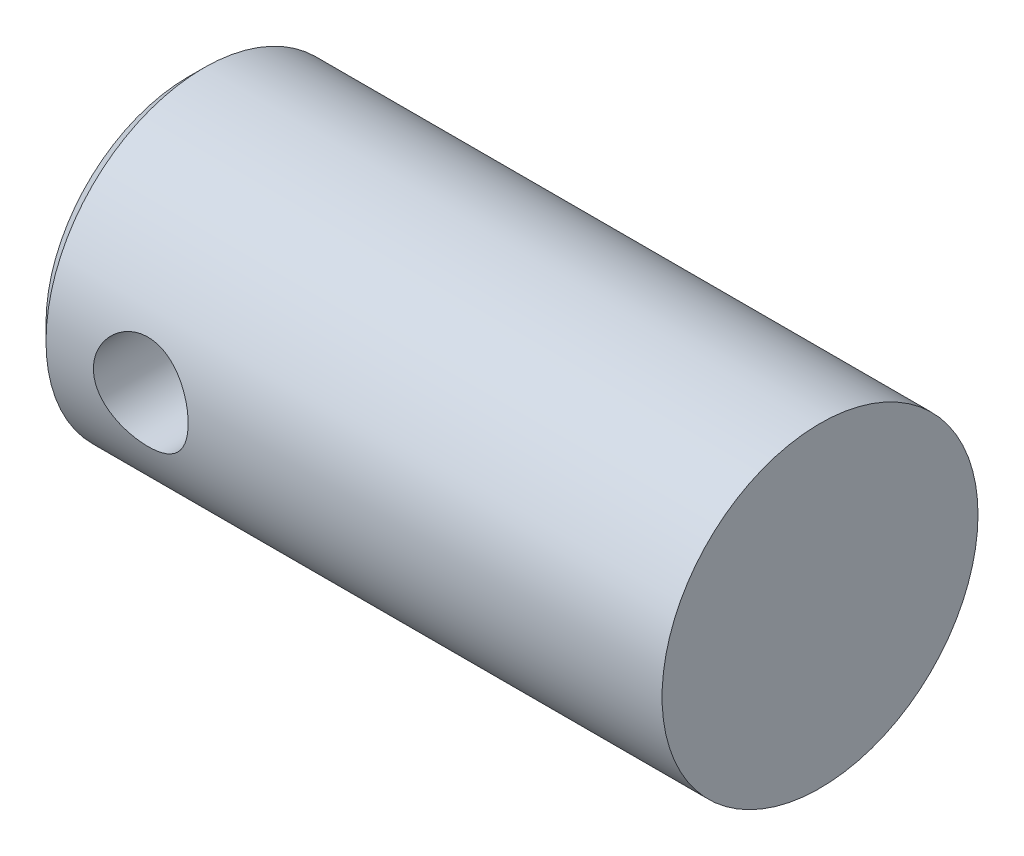
ISO-10303-21;
HEADER;
FILE_DESCRIPTION(('STEP AP214'),'2;1');
FILE_NAME('part.step','',(''),(''),'','','');
FILE_SCHEMA(('AUTOMOTIVE_DESIGN { 1 0 10303 214 1 1 1 1 }'));
ENDSEC;
DATA;
#1=APPLICATION_CONTEXT('core data for automotive mechanical design processes');
#2=APPLICATION_PROTOCOL_DEFINITION('international standard','automotive_design',2000,#1);
#3=PRODUCT_CONTEXT('',#1,'mechanical');
#4=PRODUCT('Part','Part','',(#3));
#5=PRODUCT_RELATED_PRODUCT_CATEGORY('part','',(#4));
#6=PRODUCT_DEFINITION_FORMATION('','',#4);
#7=PRODUCT_DEFINITION_CONTEXT('part definition',#1,'design');
#8=PRODUCT_DEFINITION('design','',#6,#7);
#9=PRODUCT_DEFINITION_SHAPE('','',#8);
#10=(LENGTH_UNIT() NAMED_UNIT(*) SI_UNIT(.MILLI.,.METRE.));
#11=(NAMED_UNIT(*) PLANE_ANGLE_UNIT() SI_UNIT($,.RADIAN.));
#12=(NAMED_UNIT(*) SI_UNIT($,.STERADIAN.) SOLID_ANGLE_UNIT());
#13=UNCERTAINTY_MEASURE_WITH_UNIT(LENGTH_MEASURE(1.E-05),#10,'distance_accuracy_value','');
#14=(GEOMETRIC_REPRESENTATION_CONTEXT(3) GLOBAL_UNCERTAINTY_ASSIGNED_CONTEXT((#13)) GLOBAL_UNIT_ASSIGNED_CONTEXT((#10,
#11,#12)) REPRESENTATION_CONTEXT('',''));
#15=CARTESIAN_POINT('',(0.,0.,0.));
#16=DIRECTION('',(0.,0.,1.));
#17=DIRECTION('',(1.,0.,0.));
#18=AXIS2_PLACEMENT_3D('',#15,#16,#17);
#19=CARTESIAN_POINT('',(0.,5.,0.));
#20=DIRECTION('',(1.,0.,0.));
#21=DIRECTION('',(0.,0.,-1.));
#22=AXIS2_PLACEMENT_3D('',#19,#20,#21);
#23=PLANE('',#22);
#24=CARTESIAN_POINT('',(0.,0.,0.));
#25=DIRECTION('',(1.,0.,0.));
#26=DIRECTION('',(0.,0.,-1.));
#27=AXIS2_PLACEMENT_3D('',#24,#25,#26);
#28=CIRCLE('',#27,5.);
#29=CARTESIAN_POINT('',(0.,0.,-5.));
#30=VERTEX_POINT('',#29);
#31=EDGE_CURVE('E78',#30,#30,#28,.T.);
#32=ORIENTED_EDGE('',*,*,#31,.T.);
#33=EDGE_LOOP('',(#32));
#34=FACE_BOUND('',#33,.T.);
#35=ADVANCED_FACE('F32',(#34),#23,.T.);
#36=CARTESIAN_POINT('',(0.,0.,0.));
#37=DIRECTION('',(1.,0.,0.));
#38=DIRECTION('',(0.,0.,-1.));
#39=AXIS2_PLACEMENT_3D('',#36,#37,#38);
#40=CYLINDRICAL_SURFACE('',#39,5.);
#41=CARTESIAN_POINT('',(-15.,0.,-5.));
#42=CARTESIAN_POINT('',(-15.0000009974849,-0.0822886127533,-4.99999929250549));
#43=CARTESIAN_POINT('',(-15.006793863624,-0.16458731835153,-4.99794915693953));
#44=CARTESIAN_POINT('',(-15.0337213542221,-0.326788125304881,-4.98997105593691));
#45=CARTESIAN_POINT('',(-15.0538599580233,-0.40668950441142,-4.98404193389692));
#46=CARTESIAN_POINT('',(-15.1067460169103,-0.561732707754527,-4.96895552501836));
#47=CARTESIAN_POINT('',(-15.1394748696189,-0.636881364395374,-4.95980300250425));
#48=CARTESIAN_POINT('',(-15.2165360930558,-0.780624181053132,-4.93922109237645));
#49=CARTESIAN_POINT('',(-15.2608700073954,-0.84921746746967,-4.92779140192066));
#50=CARTESIAN_POINT('',(-15.3612240074727,-0.979871797183746,-4.90350737192774));
#51=CARTESIAN_POINT('',(-15.4175166258859,-1.04171807124434,-4.89062383657036));
#52=CARTESIAN_POINT('',(-15.5396092299102,-1.15524920923324,-4.86505834210442));
#53=CARTESIAN_POINT('',(-15.605410812125,-1.20693236327441,-4.85237641724501));
#54=CARTESIAN_POINT('',(-15.7464707530376,-1.29980037723708,-4.82834113993772));
#55=CARTESIAN_POINT('',(-15.8219084609907,-1.34072309022214,-4.81702406663874));
#56=CARTESIAN_POINT('',(-15.9789892542303,-1.4092139477476,-4.79743620394031));
#57=CARTESIAN_POINT('',(-16.060630843928,-1.43678529919973,-4.7891646831331));
#58=CARTESIAN_POINT('',(-16.2253902661305,-1.47701633682652,-4.77690870838434));
#59=CARTESIAN_POINT('',(-16.3084027438639,-1.49007196234677,-4.77281069324533));
#60=CARTESIAN_POINT('',(-16.4755331562168,-1.50213730614672,-4.76902789749767));
#61=CARTESIAN_POINT('',(-16.5596508180591,-1.50115042761078,-4.76934204760571));
#62=CARTESIAN_POINT('',(-16.7233839086085,-1.48546977199812,-4.77424744067777));
#63=CARTESIAN_POINT('',(-16.8030522503622,-1.47127205262685,-4.7786838859914));
#64=CARTESIAN_POINT('',(-16.9588197862735,-1.43037420427056,-4.79108356228624));
#65=CARTESIAN_POINT('',(-17.0349186273743,-1.40367284141641,-4.7990471413235));
#66=CARTESIAN_POINT('',(-17.1826003496607,-1.33816026653682,-4.81772733074973));
#67=CARTESIAN_POINT('',(-17.2541070839553,-1.29918816934642,-4.82848016115952));
#68=CARTESIAN_POINT('',(-17.3897320220102,-1.21035222588683,-4.85150987000064));
#69=CARTESIAN_POINT('',(-17.4538484294138,-1.16048574002588,-4.86378711746991));
#70=CARTESIAN_POINT('',(-17.575686190762,-1.04881290765546,-4.88911011297937));
#71=CARTESIAN_POINT('',(-17.6330286640297,-0.986594907466973,-4.90216654310498));
#72=CARTESIAN_POINT('',(-17.7365539840643,-0.853263259313968,-4.92712244063258));
#73=CARTESIAN_POINT('',(-17.7827361284144,-0.78214905186089,-4.9390218351841));
#74=CARTESIAN_POINT('',(-17.8628599224647,-0.632355038342805,-4.9604316006947));
#75=CARTESIAN_POINT('',(-17.8967175162499,-0.553627749747951,-4.96992543668314));
#76=CARTESIAN_POINT('',(-17.9505995900996,-0.391245415603519,-4.98533521832222));
#77=CARTESIAN_POINT('',(-17.9706279285325,-0.307591751589581,-4.99125216186999));
#78=CARTESIAN_POINT('',(-17.9956521778994,-0.140952242668331,-4.99868364643538));
#79=CARTESIAN_POINT('',(-18.0011615858016,-0.0580500976011869,-5.0003485041779));
#80=CARTESIAN_POINT('',(-17.9984308442879,0.107499605823383,-4.99952923241759));
#81=CARTESIAN_POINT('',(-17.9901925303486,0.190147196690781,-4.99704565677756));
#82=CARTESIAN_POINT('',(-17.9606153888885,0.350903605309697,-4.98830696987163));
#83=CARTESIAN_POINT('',(-17.9395766124191,0.429072772614169,-4.98213829799416));
#84=CARTESIAN_POINT('',(-17.8853567672218,0.580754638954522,-4.96674347841532));
#85=CARTESIAN_POINT('',(-17.8521742389621,0.654266777025584,-4.95751696321085));
#86=CARTESIAN_POINT('',(-17.7737468345189,0.796437189461053,-4.93669654351324));
#87=CARTESIAN_POINT('',(-17.728240659052,0.864943826199669,-4.92505280829675));
#88=CARTESIAN_POINT('',(-17.6267752459472,0.993523307980147,-4.90073468764317));
#89=CARTESIAN_POINT('',(-17.5708133881123,1.05359403235594,-4.8880600443108));
#90=CARTESIAN_POINT('',(-17.4476126916307,1.16585744551027,-4.86253171869138));
#91=CARTESIAN_POINT('',(-17.3800381242283,1.21768481231504,-4.84968825033267));
#92=CARTESIAN_POINT('',(-17.2368720609865,1.30928995072154,-4.82576515238463));
#93=CARTESIAN_POINT('',(-17.1612807754418,1.34906803829472,-4.81468547654651));
#94=CARTESIAN_POINT('',(-17.0044675087453,1.41517347127168,-4.79567189615055));
#95=CARTESIAN_POINT('',(-16.9232738134634,1.4415634693705,-4.78772337843827));
#96=CARTESIAN_POINT('',(-16.7573120310685,1.48021730815114,-4.77591594362794));
#97=CARTESIAN_POINT('',(-16.6725451792123,1.49248598978779,-4.772055625083));
#98=CARTESIAN_POINT('',(-16.5056384816238,1.50221984485059,-4.76899972496087));
#99=CARTESIAN_POINT('',(-16.4235363489824,1.5002805530849,-4.76961647442754));
#100=CARTESIAN_POINT('',(-16.2608858966272,1.48307505444813,-4.77499401288294));
#101=CARTESIAN_POINT('',(-16.1803375148236,1.46780938124716,-4.77975463592551));
#102=CARTESIAN_POINT('',(-16.0240546008571,1.42476888804136,-4.79275763670385));
#103=CARTESIAN_POINT('',(-15.9482727126383,1.39715175507068,-4.80095604545964));
#104=CARTESIAN_POINT('',(-15.8023575611823,1.33031507121129,-4.81990278909136));
#105=CARTESIAN_POINT('',(-15.7322253823592,1.29109329962876,-4.83065161194312));
#106=CARTESIAN_POINT('',(-15.5968368834729,1.20048763805072,-4.85397676425833));
#107=CARTESIAN_POINT('',(-15.5318512387396,1.14871276092994,-4.86660540163797));
#108=CARTESIAN_POINT('',(-15.4112975016921,1.03517434629782,-4.89201320450026));
#109=CARTESIAN_POINT('',(-15.3557318605322,0.9734082171345,-4.90479240823905));
#110=CARTESIAN_POINT('',(-15.253976587705,0.839465762183248,-4.92950936570649));
#111=CARTESIAN_POINT('',(-15.2081085531445,0.767037885790607,-4.94141159765674));
#112=CARTESIAN_POINT('',(-15.129264830096,0.615141373983529,-4.96260680455813));
#113=CARTESIAN_POINT('',(-15.0962831117255,0.535676052998954,-4.97190099931066));
#114=CARTESIAN_POINT('',(-15.0471047243473,0.380757712655281,-4.98602174969301));
#115=CARTESIAN_POINT('',(-15.0294883271168,0.305786961954234,-4.99122027381067));
#116=CARTESIAN_POINT('',(-15.0059364747584,0.153880195230779,-4.99820944494492));
#117=CARTESIAN_POINT('',(-14.9999990672952,0.0769445098581395,-5.0000006615474));
#118=CARTESIAN_POINT('',(-15.,0.,-5.));
#119=B_SPLINE_CURVE_WITH_KNOTS('',3,(#41,#42,#43,#44,#45,#46,#47,#48,#49,#50,#51,#52,#53,#54,
#55,#56,#57,#58,#59,#60,#61,#62,#63,#64,#65,#66,#67,#68,#69,#70,#71,#72,#73,#74,#75,#76,#77,#78,
#79,#80,#81,#82,#83,#84,#85,#86,#87,#88,#89,#90,#91,#92,#93,#94,#95,#96,#97,#98,#99,#100,#101,
#102,#103,#104,#105,#106,#107,#108,#109,#110,#111,#112,#113,#114,#115,#116,#117,#118),
.UNSPECIFIED.,.T.,.F.,(4,2,2,2,2,2,2,2,2,2,2,2,2,2,2,2,2,2,2,2,2,2,2,2,2,2,2,2,2,2,2,2,2,2,2,2,
2,2,4),(0.,0.246583203612611,0.493239964846,0.739533676300876,0.985860164412704,
1.23855602948192,1.49129437288633,1.74971481004109,2.00807314543224,2.25919689356599,
2.5102597831909,2.75226016697676,2.99428443658001,3.2396242644712,3.48502360158555,
3.74067104048167,3.99633456531072,4.25371046881689,4.51101453528808,4.75908809438545,
5.00712853550327,5.24956746682327,5.49203554593729,5.74011305702908,5.98825282000191,
6.24540400322819,6.50254844252681,6.75847814951252,7.01432009460283,7.25950155466943,
7.504673196616,7.74680040402722,7.98897397553108,8.23996925679931,8.49102974897503,
8.74942996156671,9.00770911595235,9.2383169193046,9.46888616948875),.UNSPECIFIED.);
#120=CARTESIAN_POINT('',(-15.,0.,-5.));
#121=VERTEX_POINT('',#120);
#122=EDGE_CURVE('E10',#121,#121,#119,.T.);
#123=ORIENTED_EDGE('',*,*,#122,.F.);
#124=EDGE_LOOP('',(#123));
#125=FACE_BOUND('',#124,.T.);
#126=CARTESIAN_POINT('',(-15.,0.,5.));
#127=CARTESIAN_POINT('',(-15.0000009974849,0.0822886127533,4.99999929250549));
#128=CARTESIAN_POINT('',(-15.006793863624,0.16458731835153,4.99794915693953));
#129=CARTESIAN_POINT('',(-15.0337213542221,0.326788125304881,4.98997105593691));
#130=CARTESIAN_POINT('',(-15.0538599580233,0.40668950441142,4.98404193389692));
#131=CARTESIAN_POINT('',(-15.1067460169103,0.561732707754527,4.96895552501836));
#132=CARTESIAN_POINT('',(-15.1394748696189,0.636881364395374,4.95980300250425));
#133=CARTESIAN_POINT('',(-15.2165360930558,0.780624181053132,4.93922109237645));
#134=CARTESIAN_POINT('',(-15.2608700073954,0.84921746746967,4.92779140192066));
#135=CARTESIAN_POINT('',(-15.3612240074727,0.979871797183746,4.90350737192774));
#136=CARTESIAN_POINT('',(-15.4175166258859,1.04171807124434,4.89062383657036));
#137=CARTESIAN_POINT('',(-15.5396092299102,1.15524920923324,4.86505834210442));
#138=CARTESIAN_POINT('',(-15.605410812125,1.20693236327441,4.85237641724501));
#139=CARTESIAN_POINT('',(-15.7464707530376,1.29980037723708,4.82834113993772));
#140=CARTESIAN_POINT('',(-15.8219084609907,1.34072309022214,4.81702406663874));
#141=CARTESIAN_POINT('',(-15.9789892542303,1.4092139477476,4.79743620394031));
#142=CARTESIAN_POINT('',(-16.060630843928,1.43678529919973,4.7891646831331));
#143=CARTESIAN_POINT('',(-16.2253902661305,1.47701633682652,4.77690870838434));
#144=CARTESIAN_POINT('',(-16.3084027438639,1.49007196234677,4.77281069324533));
#145=CARTESIAN_POINT('',(-16.4755331562168,1.50213730614672,4.76902789749767));
#146=CARTESIAN_POINT('',(-16.5596508180591,1.50115042761078,4.76934204760571));
#147=CARTESIAN_POINT('',(-16.7233839086085,1.48546977199812,4.77424744067777));
#148=CARTESIAN_POINT('',(-16.8030522503622,1.47127205262685,4.7786838859914));
#149=CARTESIAN_POINT('',(-16.9588197862735,1.43037420427056,4.79108356228624));
#150=CARTESIAN_POINT('',(-17.0349186273743,1.40367284141641,4.7990471413235));
#151=CARTESIAN_POINT('',(-17.1826003496607,1.33816026653682,4.81772733074973));
#152=CARTESIAN_POINT('',(-17.2541070839553,1.29918816934642,4.82848016115952));
#153=CARTESIAN_POINT('',(-17.3897320220102,1.21035222588683,4.85150987000064));
#154=CARTESIAN_POINT('',(-17.4538484294138,1.16048574002588,4.86378711746991));
#155=CARTESIAN_POINT('',(-17.575686190762,1.04881290765546,4.88911011297937));
#156=CARTESIAN_POINT('',(-17.6330286640297,0.986594907466973,4.90216654310498));
#157=CARTESIAN_POINT('',(-17.7365539840643,0.853263259313968,4.92712244063258));
#158=CARTESIAN_POINT('',(-17.7827361284144,0.78214905186089,4.9390218351841));
#159=CARTESIAN_POINT('',(-17.8628599224647,0.632355038342805,4.9604316006947));
#160=CARTESIAN_POINT('',(-17.8967175162499,0.553627749747951,4.96992543668314));
#161=CARTESIAN_POINT('',(-17.9505995900996,0.391245415603519,4.98533521832222));
#162=CARTESIAN_POINT('',(-17.9706279285325,0.307591751589581,4.99125216186999));
#163=CARTESIAN_POINT('',(-17.9956521778994,0.140952242668331,4.99868364643538));
#164=CARTESIAN_POINT('',(-18.0011615858016,0.0580500976011869,5.0003485041779));
#165=CARTESIAN_POINT('',(-17.9984308442879,-0.107499605823383,4.99952923241759));
#166=CARTESIAN_POINT('',(-17.9901925303486,-0.190147196690781,4.99704565677756));
#167=CARTESIAN_POINT('',(-17.9606153888885,-0.350903605309697,4.98830696987163));
#168=CARTESIAN_POINT('',(-17.9395766124191,-0.429072772614169,4.98213829799416));
#169=CARTESIAN_POINT('',(-17.8853567672218,-0.580754638954522,4.96674347841532));
#170=CARTESIAN_POINT('',(-17.8521742389621,-0.654266777025584,4.95751696321085));
#171=CARTESIAN_POINT('',(-17.7737468345189,-0.796437189461053,4.93669654351324));
#172=CARTESIAN_POINT('',(-17.728240659052,-0.864943826199669,4.92505280829675));
#173=CARTESIAN_POINT('',(-17.6267752459472,-0.993523307980147,4.90073468764317));
#174=CARTESIAN_POINT('',(-17.5708133881123,-1.05359403235594,4.8880600443108));
#175=CARTESIAN_POINT('',(-17.4476126916307,-1.16585744551027,4.86253171869138));
#176=CARTESIAN_POINT('',(-17.3800381242283,-1.21768481231504,4.84968825033267));
#177=CARTESIAN_POINT('',(-17.2368720609865,-1.30928995072154,4.82576515238463));
#178=CARTESIAN_POINT('',(-17.1612807754418,-1.34906803829472,4.81468547654651));
#179=CARTESIAN_POINT('',(-17.0044675087453,-1.41517347127168,4.79567189615055));
#180=CARTESIAN_POINT('',(-16.9232738134634,-1.4415634693705,4.78772337843827));
#181=CARTESIAN_POINT('',(-16.7573120310685,-1.48021730815114,4.77591594362794));
#182=CARTESIAN_POINT('',(-16.6725451792123,-1.49248598978779,4.772055625083));
#183=CARTESIAN_POINT('',(-16.5056384816238,-1.50221984485059,4.76899972496087));
#184=CARTESIAN_POINT('',(-16.4235363489824,-1.5002805530849,4.76961647442754));
#185=CARTESIAN_POINT('',(-16.2608858966272,-1.48307505444813,4.77499401288294));
#186=CARTESIAN_POINT('',(-16.1803375148236,-1.46780938124716,4.77975463592551));
#187=CARTESIAN_POINT('',(-16.0240546008571,-1.42476888804136,4.79275763670385));
#188=CARTESIAN_POINT('',(-15.9482727126383,-1.39715175507068,4.80095604545964));
#189=CARTESIAN_POINT('',(-15.8023575611823,-1.33031507121129,4.81990278909136));
#190=CARTESIAN_POINT('',(-15.7322253823592,-1.29109329962876,4.83065161194312));
#191=CARTESIAN_POINT('',(-15.5968368834729,-1.20048763805072,4.85397676425833));
#192=CARTESIAN_POINT('',(-15.5318512387396,-1.14871276092994,4.86660540163797));
#193=CARTESIAN_POINT('',(-15.4112975016921,-1.03517434629782,4.89201320450026));
#194=CARTESIAN_POINT('',(-15.3557318605322,-0.9734082171345,4.90479240823905));
#195=CARTESIAN_POINT('',(-15.253976587705,-0.839465762183248,4.92950936570649));
#196=CARTESIAN_POINT('',(-15.2081085531445,-0.767037885790607,4.94141159765674));
#197=CARTESIAN_POINT('',(-15.129264830096,-0.615141373983529,4.96260680455813));
#198=CARTESIAN_POINT('',(-15.0962831117255,-0.535676052998954,4.97190099931066));
#199=CARTESIAN_POINT('',(-15.0471047243473,-0.380757712655281,4.98602174969301));
#200=CARTESIAN_POINT('',(-15.0294883271168,-0.305786961954234,4.99122027381067));
#201=CARTESIAN_POINT('',(-15.0059364747584,-0.153880195230779,4.99820944494492));
#202=CARTESIAN_POINT('',(-14.9999990672952,-0.0769445098581395,5.0000006615474));
#203=CARTESIAN_POINT('',(-15.,0.,5.));
#204=B_SPLINE_CURVE_WITH_KNOTS('',3,(#126,#127,#128,#129,#130,#131,#132,#133,#134,#135,#136,
#137,#138,#139,#140,#141,#142,#143,#144,#145,#146,#147,#148,#149,#150,#151,#152,#153,#154,#155,
#156,#157,#158,#159,#160,#161,#162,#163,#164,#165,#166,#167,#168,#169,#170,#171,#172,#173,#174,
#175,#176,#177,#178,#179,#180,#181,#182,#183,#184,#185,#186,#187,#188,#189,#190,#191,#192,#193,
#194,#195,#196,#197,#198,#199,#200,#201,#202,#203),.UNSPECIFIED.,.T.,.F.,(4,2,2,2,2,2,2,2,2,2,2,
2,2,2,2,2,2,2,2,2,2,2,2,2,2,2,2,2,2,2,2,2,2,2,2,2,2,2,4),(0.,0.246583203612611,0.493239964846,
0.739533676300876,0.985860164412704,1.23855602948192,1.49129437288633,1.74971481004109,
2.00807314543224,2.25919689356599,2.5102597831909,2.75226016697676,2.99428443658001,
3.2396242644712,3.48502360158555,3.74067104048167,3.99633456531072,4.25371046881689,
4.51101453528808,4.75908809438545,5.00712853550327,5.24956746682327,5.49203554593729,
5.74011305702908,5.98825282000191,6.24540400322819,6.50254844252681,6.75847814951252,
7.01432009460283,7.25950155466943,7.504673196616,7.74680040402722,7.98897397553108,
8.23996925679931,8.49102974897503,8.74942996156671,9.00770911595235,9.2383169193046,
9.46888616948875),.UNSPECIFIED.);
#205=CARTESIAN_POINT('',(-15.,0.,5.));
#206=VERTEX_POINT('',#205);
#207=EDGE_CURVE('E43',#206,#206,#204,.T.);
#208=ORIENTED_EDGE('',*,*,#207,.F.);
#209=EDGE_LOOP('',(#208));
#210=FACE_BOUND('',#209,.T.);
#211=CARTESIAN_POINT('',(-19.5,0.,0.));
#212=DIRECTION('',(-1.,0.,0.));
#213=DIRECTION('',(0.,0.,1.));
#214=AXIS2_PLACEMENT_3D('',#211,#212,#213);
#215=CIRCLE('',#214,5.);
#216=CARTESIAN_POINT('',(-19.5,0.,5.));
#217=VERTEX_POINT('',#216);
#218=EDGE_CURVE('E51',#217,#217,#215,.F.);
#219=ORIENTED_EDGE('',*,*,#218,.T.);
#220=EDGE_LOOP('',(#219));
#221=FACE_BOUND('',#220,.T.);
#222=ORIENTED_EDGE('',*,*,#31,.F.);
#223=EDGE_LOOP('',(#222));
#224=FACE_BOUND('',#223,.T.);
#225=ADVANCED_FACE('F56',(#125,#210,#221,#224),#40,.T.);
#226=CARTESIAN_POINT('',(-20.,0.,0.));
#227=DIRECTION('',(-1.,0.,0.));
#228=DIRECTION('',(0.,0.,1.));
#229=AXIS2_PLACEMENT_3D('',#226,#227,#228);
#230=PLANE('',#229);
#231=CARTESIAN_POINT('',(-20.,0.,0.));
#232=DIRECTION('',(-1.,0.,0.));
#233=DIRECTION('',(0.,0.,1.));
#234=AXIS2_PLACEMENT_3D('',#231,#232,#233);
#235=CIRCLE('',#234,4.49999999999999);
#236=CARTESIAN_POINT('',(-20.,0.,4.49999999999999));
#237=VERTEX_POINT('',#236);
#238=EDGE_CURVE('E47',#237,#237,#235,.T.);
#239=ORIENTED_EDGE('',*,*,#238,.T.);
#240=EDGE_LOOP('',(#239));
#241=FACE_BOUND('',#240,.T.);
#242=ADVANCED_FACE('F62',(#241),#230,.T.);
#243=CARTESIAN_POINT('',(-19.5,0.,0.));
#244=DIRECTION('',(1.,0.,0.));
#245=DIRECTION('',(0.,0.,-1.));
#246=AXIS2_PLACEMENT_3D('',#243,#244,#245);
#247=CONICAL_SURFACE('',#246,5.,0.785398163397454);
#248=ORIENTED_EDGE('',*,*,#238,.F.);
#249=EDGE_LOOP('',(#248));
#250=FACE_BOUND('',#249,.T.);
#251=ORIENTED_EDGE('',*,*,#218,.F.);
#252=EDGE_LOOP('',(#251));
#253=FACE_BOUND('',#252,.T.);
#254=ADVANCED_FACE('F34',(#250,#253),#247,.T.);
#255=CARTESIAN_POINT('',(-16.5,0.,-5.));
#256=DIRECTION('',(0.,0.,1.));
#257=DIRECTION('',(1.,0.,0.));
#258=AXIS2_PLACEMENT_3D('',#255,#256,#257);
#259=CYLINDRICAL_SURFACE('',#258,1.5);
#260=ORIENTED_EDGE('',*,*,#122,.T.);
#261=EDGE_LOOP('',(#260));
#262=FACE_BOUND('',#261,.T.);
#263=ORIENTED_EDGE('',*,*,#207,.T.);
#264=EDGE_LOOP('',(#263));
#265=FACE_BOUND('',#264,.T.);
#266=ADVANCED_FACE('F59',(#262,#265),#259,.F.);
#267=CLOSED_SHELL('',(#35,#225,#242,#254,#266));
#268=MANIFOLD_SOLID_BREP('B2',#267);
#269=ADVANCED_BREP_SHAPE_REPRESENTATION('',(#18,#268),#14);
#270=SHAPE_DEFINITION_REPRESENTATION(#9,#269);
ENDSEC;
END-ISO-10303-21;
